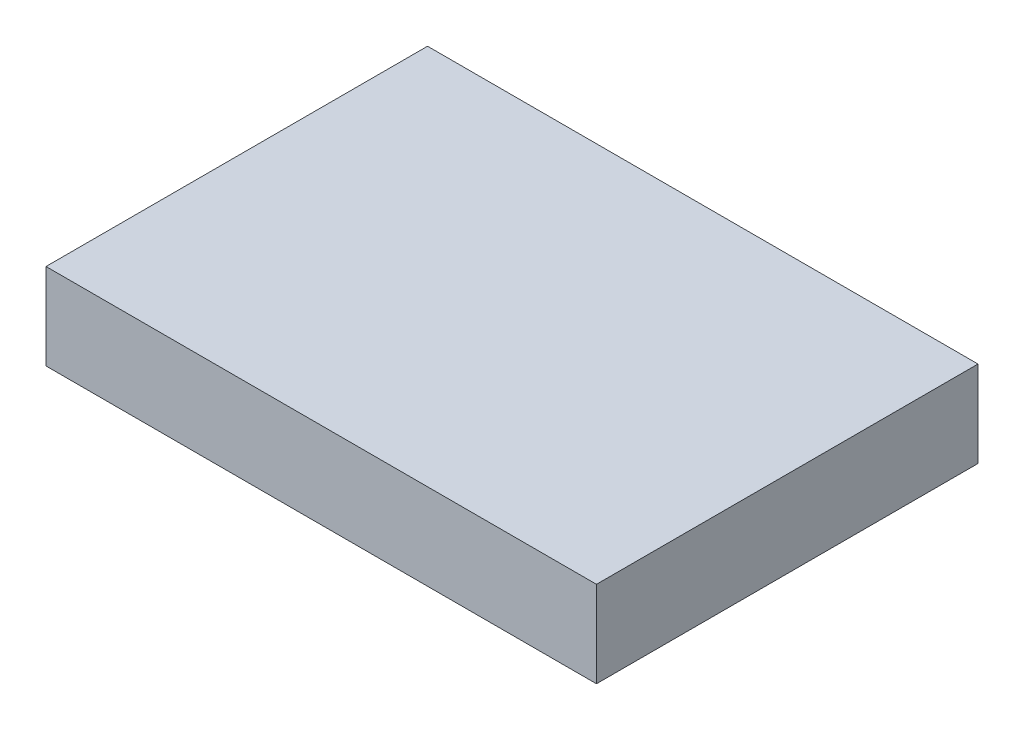
ISO-10303-21;
HEADER;
FILE_DESCRIPTION(('STEP AP214'),'2;1');
FILE_NAME('part.step','',(''),(''),'','','');
FILE_SCHEMA(('AUTOMOTIVE_DESIGN { 1 0 10303 214 1 1 1 1 }'));
ENDSEC;
DATA;
#1=APPLICATION_CONTEXT('core data for automotive mechanical design processes');
#2=APPLICATION_PROTOCOL_DEFINITION('international standard','automotive_design',2000,#1);
#3=PRODUCT_CONTEXT('',#1,'mechanical');
#4=PRODUCT('Part','Part','',(#3));
#5=PRODUCT_RELATED_PRODUCT_CATEGORY('part','',(#4));
#6=PRODUCT_DEFINITION_FORMATION('','',#4);
#7=PRODUCT_DEFINITION_CONTEXT('part definition',#1,'design');
#8=PRODUCT_DEFINITION('design','',#6,#7);
#9=PRODUCT_DEFINITION_SHAPE('','',#8);
#10=(LENGTH_UNIT() NAMED_UNIT(*) SI_UNIT(.MILLI.,.METRE.));
#11=(NAMED_UNIT(*) PLANE_ANGLE_UNIT() SI_UNIT($,.RADIAN.));
#12=(NAMED_UNIT(*) SI_UNIT($,.STERADIAN.) SOLID_ANGLE_UNIT());
#13=UNCERTAINTY_MEASURE_WITH_UNIT(LENGTH_MEASURE(1.E-05),#10,'distance_accuracy_value','');
#14=(GEOMETRIC_REPRESENTATION_CONTEXT(3) GLOBAL_UNCERTAINTY_ASSIGNED_CONTEXT((#13)) GLOBAL_UNIT_ASSIGNED_CONTEXT((#10,
#11,#12)) REPRESENTATION_CONTEXT('',''));
#15=CARTESIAN_POINT('',(0.,0.,0.));
#16=DIRECTION('',(0.,0.,1.));
#17=DIRECTION('',(1.,0.,0.));
#18=AXIS2_PLACEMENT_3D('',#15,#16,#17);
#19=CARTESIAN_POINT('',(-12.3107251697089,2.1,20.1299712543958));
#20=DIRECTION('',(1.,0.,0.));
#21=DIRECTION('',(0.,0.,-1.));
#22=AXIS2_PLACEMENT_3D('',#19,#20,#21);
#23=PLANE('',#22);
#24=DIRECTION('',(0.,0.,1.));
#25=VECTOR('',#24,1.);
#26=CARTESIAN_POINT('',(-12.3107251697089,0.,20.1299712543958));
#27=LINE('',#26,#25);
#28=CARTESIAN_POINT('',(-12.3107251697089,0.,10.83117395214));
#29=VERTEX_POINT('',#28);
#30=CARTESIAN_POINT('',(-12.3107251697089,0.,20.1299712543958));
#31=VERTEX_POINT('',#30);
#32=EDGE_CURVE('E96',#29,#31,#27,.T.);
#33=ORIENTED_EDGE('',*,*,#32,.T.);
#34=DIRECTION('',(0.,-1.,0.));
#35=VECTOR('',#34,1.);
#36=CARTESIAN_POINT('',(-12.3107251697089,2.1,20.1299712543958));
#37=LINE('',#36,#35);
#38=CARTESIAN_POINT('',(-12.3107251697089,2.1,20.1299712543958));
#39=VERTEX_POINT('',#38);
#40=EDGE_CURVE('E11',#39,#31,#37,.T.);
#41=ORIENTED_EDGE('',*,*,#40,.F.);
#42=DIRECTION('',(0.,0.,1.));
#43=VECTOR('',#42,1.);
#44=CARTESIAN_POINT('',(-12.3107251697089,2.1,20.1299712543958));
#45=LINE('',#44,#43);
#46=CARTESIAN_POINT('',(-12.3107251697089,2.1,10.83117395214));
#47=VERTEX_POINT('',#46);
#48=EDGE_CURVE('E84',#47,#39,#45,.T.);
#49=ORIENTED_EDGE('',*,*,#48,.F.);
#50=DIRECTION('',(0.,-1.,0.));
#51=VECTOR('',#50,1.);
#52=CARTESIAN_POINT('',(-12.3107251697089,2.1,10.83117395214));
#53=LINE('',#52,#51);
#54=EDGE_CURVE('E92',#47,#29,#53,.T.);
#55=ORIENTED_EDGE('',*,*,#54,.T.);
#56=EDGE_LOOP('',(#33,#41,#49,#55));
#57=FACE_BOUND('',#56,.T.);
#58=ADVANCED_FACE('F33',(#57),#23,.F.);
#59=CARTESIAN_POINT('',(-12.3107251697089,2.1,20.1299712543958));
#60=DIRECTION('',(0.,0.,-1.));
#61=DIRECTION('',(-1.,0.,0.));
#62=AXIS2_PLACEMENT_3D('',#59,#60,#61);
#63=PLANE('',#62);
#64=DIRECTION('',(1.,0.,0.));
#65=VECTOR('',#64,1.);
#66=CARTESIAN_POINT('',(-12.3107251697089,0.,20.1299712543958));
#67=LINE('',#66,#65);
#68=CARTESIAN_POINT('',(1.10509689232463,0.,20.1299712543958));
#69=VERTEX_POINT('',#68);
#70=EDGE_CURVE('E88',#31,#69,#67,.T.);
#71=ORIENTED_EDGE('',*,*,#70,.T.);
#72=DIRECTION('',(0.,-1.,0.));
#73=VECTOR('',#72,1.);
#74=CARTESIAN_POINT('',(1.10509689232463,2.1,20.1299712543958));
#75=LINE('',#74,#73);
#76=CARTESIAN_POINT('',(1.10509689232463,2.1,20.1299712543958));
#77=VERTEX_POINT('',#76);
#78=EDGE_CURVE('E41',#77,#69,#75,.T.);
#79=ORIENTED_EDGE('',*,*,#78,.F.);
#80=DIRECTION('',(1.,0.,0.));
#81=VECTOR('',#80,1.);
#82=CARTESIAN_POINT('',(-12.3107251697089,2.1,20.1299712543958));
#83=LINE('',#82,#81);
#84=EDGE_CURVE('E79',#39,#77,#83,.T.);
#85=ORIENTED_EDGE('',*,*,#84,.F.);
#86=ORIENTED_EDGE('',*,*,#40,.T.);
#87=EDGE_LOOP('',(#71,#79,#85,#86));
#88=FACE_BOUND('',#87,.T.);
#89=ADVANCED_FACE('F87',(#88),#63,.F.);
#90=CARTESIAN_POINT('',(1.10509689232463,2.1,20.1299712543958));
#91=DIRECTION('',(-1.,0.,0.));
#92=DIRECTION('',(0.,0.,1.));
#93=AXIS2_PLACEMENT_3D('',#90,#91,#92);
#94=PLANE('',#93);
#95=DIRECTION('',(0.,0.,-1.));
#96=VECTOR('',#95,1.);
#97=CARTESIAN_POINT('',(1.10509689232463,0.,20.1299712543958));
#98=LINE('',#97,#96);
#99=CARTESIAN_POINT('',(1.10509689232463,0.,10.83117395214));
#100=VERTEX_POINT('',#99);
#101=EDGE_CURVE('E66',#69,#100,#98,.T.);
#102=ORIENTED_EDGE('',*,*,#101,.T.);
#103=DIRECTION('',(0.,-1.,0.));
#104=VECTOR('',#103,1.);
#105=CARTESIAN_POINT('',(1.10509689232463,2.1,10.83117395214));
#106=LINE('',#105,#104);
#107=CARTESIAN_POINT('',(1.10509689232463,2.1,10.83117395214));
#108=VERTEX_POINT('',#107);
#109=EDGE_CURVE('E89',#108,#100,#106,.T.);
#110=ORIENTED_EDGE('',*,*,#109,.F.);
#111=DIRECTION('',(0.,0.,-1.));
#112=VECTOR('',#111,1.);
#113=CARTESIAN_POINT('',(1.10509689232463,2.1,20.1299712543958));
#114=LINE('',#113,#112);
#115=EDGE_CURVE('E82',#77,#108,#114,.T.);
#116=ORIENTED_EDGE('',*,*,#115,.F.);
#117=ORIENTED_EDGE('',*,*,#78,.T.);
#118=EDGE_LOOP('',(#102,#110,#116,#117));
#119=FACE_BOUND('',#118,.T.);
#120=ADVANCED_FACE('F90',(#119),#94,.F.);
#121=CARTESIAN_POINT('',(-12.3107251697089,2.1,10.83117395214));
#122=DIRECTION('',(0.,0.,1.));
#123=DIRECTION('',(1.,0.,0.));
#124=AXIS2_PLACEMENT_3D('',#121,#122,#123);
#125=PLANE('',#124);
#126=DIRECTION('',(-1.,0.,0.));
#127=VECTOR('',#126,1.);
#128=CARTESIAN_POINT('',(-12.3107251697089,0.,10.83117395214));
#129=LINE('',#128,#127);
#130=EDGE_CURVE('E72',#100,#29,#129,.T.);
#131=ORIENTED_EDGE('',*,*,#130,.T.);
#132=ORIENTED_EDGE('',*,*,#54,.F.);
#133=DIRECTION('',(-1.,0.,0.));
#134=VECTOR('',#133,1.);
#135=CARTESIAN_POINT('',(-12.3107251697089,2.1,10.83117395214));
#136=LINE('',#135,#134);
#137=EDGE_CURVE('E49',#108,#47,#136,.T.);
#138=ORIENTED_EDGE('',*,*,#137,.F.);
#139=ORIENTED_EDGE('',*,*,#109,.T.);
#140=EDGE_LOOP('',(#131,#132,#138,#139));
#141=FACE_BOUND('',#140,.T.);
#142=ADVANCED_FACE('F103',(#141),#125,.F.);
#143=CARTESIAN_POINT('',(0.,2.1,0.));
#144=DIRECTION('',(0.,-1.,0.));
#145=DIRECTION('',(0.,0.,-1.));
#146=AXIS2_PLACEMENT_3D('',#143,#144,#145);
#147=PLANE('',#146);
#148=ORIENTED_EDGE('',*,*,#48,.T.);
#149=ORIENTED_EDGE('',*,*,#84,.T.);
#150=ORIENTED_EDGE('',*,*,#115,.T.);
#151=ORIENTED_EDGE('',*,*,#137,.T.);
#152=EDGE_LOOP('',(#148,#149,#150,#151));
#153=FACE_BOUND('',#152,.T.);
#154=ADVANCED_FACE('F80',(#153),#147,.F.);
#155=CARTESIAN_POINT('',(0.,0.,0.));
#156=DIRECTION('',(0.,-1.,0.));
#157=DIRECTION('',(0.,0.,-1.));
#158=AXIS2_PLACEMENT_3D('',#155,#156,#157);
#159=PLANE('',#158);
#160=ORIENTED_EDGE('',*,*,#32,.F.);
#161=ORIENTED_EDGE('',*,*,#130,.F.);
#162=ORIENTED_EDGE('',*,*,#101,.F.);
#163=ORIENTED_EDGE('',*,*,#70,.F.);
#164=EDGE_LOOP('',(#160,#161,#162,#163));
#165=FACE_BOUND('',#164,.T.);
#166=ADVANCED_FACE('F106',(#165),#159,.T.);
#167=CLOSED_SHELL('',(#58,#89,#120,#142,#154,#166));
#168=MANIFOLD_SOLID_BREP('B2',#167);
#169=ADVANCED_BREP_SHAPE_REPRESENTATION('',(#18,#168),#14);
#170=SHAPE_DEFINITION_REPRESENTATION(#9,#169);
ENDSEC;
END-ISO-10303-21;
